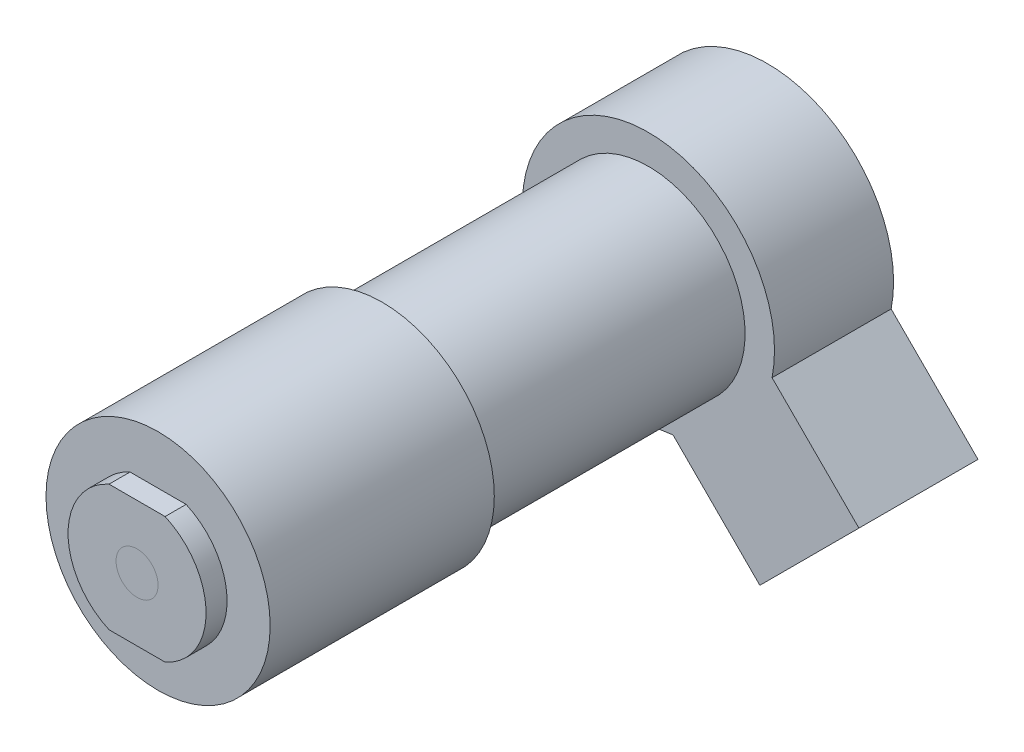
ISO-10303-21;
HEADER;
FILE_DESCRIPTION(('STEP AP214'),'2;1');
FILE_NAME('part.step','',(''),(''),'','','');
FILE_SCHEMA(('AUTOMOTIVE_DESIGN { 1 0 10303 214 1 1 1 1 }'));
ENDSEC;
DATA;
#1=APPLICATION_CONTEXT('core data for automotive mechanical design processes');
#2=APPLICATION_PROTOCOL_DEFINITION('international standard','automotive_design',2000,#1);
#3=PRODUCT_CONTEXT('',#1,'mechanical');
#4=PRODUCT('Part','Part','',(#3));
#5=PRODUCT_RELATED_PRODUCT_CATEGORY('part','',(#4));
#6=PRODUCT_DEFINITION_FORMATION('','',#4);
#7=PRODUCT_DEFINITION_CONTEXT('part definition',#1,'design');
#8=PRODUCT_DEFINITION('design','',#6,#7);
#9=PRODUCT_DEFINITION_SHAPE('','',#8);
#10=(LENGTH_UNIT() NAMED_UNIT(*) SI_UNIT(.MILLI.,.METRE.));
#11=(NAMED_UNIT(*) PLANE_ANGLE_UNIT() SI_UNIT($,.RADIAN.));
#12=(NAMED_UNIT(*) SI_UNIT($,.STERADIAN.) SOLID_ANGLE_UNIT());
#13=UNCERTAINTY_MEASURE_WITH_UNIT(LENGTH_MEASURE(1.E-05),#10,'distance_accuracy_value','');
#14=(GEOMETRIC_REPRESENTATION_CONTEXT(3) GLOBAL_UNCERTAINTY_ASSIGNED_CONTEXT((#13)) GLOBAL_UNIT_ASSIGNED_CONTEXT((#10,
#11,#12)) REPRESENTATION_CONTEXT('',''));
#15=CARTESIAN_POINT('',(0.,0.,0.));
#16=DIRECTION('',(0.,0.,1.));
#17=DIRECTION('',(1.,0.,0.));
#18=AXIS2_PLACEMENT_3D('',#15,#16,#17);
#19=CARTESIAN_POINT('',(0.,0.,3.));
#20=DIRECTION('',(0.,0.,1.));
#21=DIRECTION('',(1.,0.,0.));
#22=AXIS2_PLACEMENT_3D('',#19,#20,#21);
#23=PLANE('',#22);
#24=CARTESIAN_POINT('',(0.,0.,3.));
#25=DIRECTION('',(0.,0.,1.));
#26=DIRECTION('',(1.,0.,0.));
#27=AXIS2_PLACEMENT_3D('',#24,#25,#26);
#28=CIRCLE('',#27,9.85);
#29=CARTESIAN_POINT('',(-4.00281151192509,9.,3.));
#30=VERTEX_POINT('',#29);
#31=CARTESIAN_POINT('',(-4.00281151192509,-9.,3.));
#32=VERTEX_POINT('',#31);
#33=EDGE_CURVE('E159',#30,#32,#28,.T.);
#34=ORIENTED_EDGE('',*,*,#33,.T.);
#35=DIRECTION('',(1.,0.,0.));
#36=VECTOR('',#35,1.);
#37=CARTESIAN_POINT('',(-4.00281151192509,-9.,3.));
#38=LINE('',#37,#36);
#39=CARTESIAN_POINT('',(4.00281151192509,-9.,3.));
#40=VERTEX_POINT('',#39);
#41=EDGE_CURVE('E161',#32,#40,#38,.T.);
#42=ORIENTED_EDGE('',*,*,#41,.T.);
#43=CARTESIAN_POINT('',(0.,0.,3.));
#44=DIRECTION('',(0.,0.,1.));
#45=DIRECTION('',(1.,0.,0.));
#46=AXIS2_PLACEMENT_3D('',#43,#44,#45);
#47=CIRCLE('',#46,9.85);
#48=CARTESIAN_POINT('',(4.00281151192509,9.,3.));
#49=VERTEX_POINT('',#48);
#50=EDGE_CURVE('E164',#40,#49,#47,.T.);
#51=ORIENTED_EDGE('',*,*,#50,.T.);
#52=DIRECTION('',(-1.,0.,0.));
#53=VECTOR('',#52,1.);
#54=CARTESIAN_POINT('',(-4.00281151192509,9.,3.));
#55=LINE('',#54,#53);
#56=EDGE_CURVE('E60',#49,#30,#55,.T.);
#57=ORIENTED_EDGE('',*,*,#56,.T.);
#58=EDGE_LOOP('',(#34,#42,#51,#57));
#59=FACE_BOUND('',#58,.T.);
#60=CARTESIAN_POINT('',(0.,0.,3.));
#61=DIRECTION('',(0.,0.,1.));
#62=DIRECTION('',(1.,0.,0.));
#63=AXIS2_PLACEMENT_3D('',#60,#61,#62);
#64=CIRCLE('',#63,3.);
#65=CARTESIAN_POINT('',(3.,0.,3.));
#66=VERTEX_POINT('',#65);
#67=EDGE_CURVE('E11',#66,#66,#64,.F.);
#68=ORIENTED_EDGE('',*,*,#67,.T.);
#69=EDGE_LOOP('',(#68));
#70=FACE_BOUND('',#69,.T.);
#71=ADVANCED_FACE('F43',(#59,#70),#23,.T.);
#72=CARTESIAN_POINT('',(0.,0.,3.));
#73=DIRECTION('',(0.,0.,-1.));
#74=DIRECTION('',(-1.,0.,0.));
#75=AXIS2_PLACEMENT_3D('',#72,#73,#74);
#76=CYLINDRICAL_SURFACE('',#75,9.85);
#77=CARTESIAN_POINT('',(0.,0.,0.));
#78=DIRECTION('',(0.,0.,1.));
#79=DIRECTION('',(1.,0.,0.));
#80=AXIS2_PLACEMENT_3D('',#77,#78,#79);
#81=CIRCLE('',#80,9.85);
#82=CARTESIAN_POINT('',(-4.00281151192509,9.,0.));
#83=VERTEX_POINT('',#82);
#84=CARTESIAN_POINT('',(-4.00281151192509,-9.,0.));
#85=VERTEX_POINT('',#84);
#86=EDGE_CURVE('E156',#83,#85,#81,.T.);
#87=ORIENTED_EDGE('',*,*,#86,.T.);
#88=DIRECTION('',(0.,0.,-1.));
#89=VECTOR('',#88,1.);
#90=CARTESIAN_POINT('',(-4.00281151192509,-9.,3.));
#91=LINE('',#90,#89);
#92=EDGE_CURVE('E152',#32,#85,#91,.T.);
#93=ORIENTED_EDGE('',*,*,#92,.F.);
#94=ORIENTED_EDGE('',*,*,#33,.F.);
#95=DIRECTION('',(0.,0.,-1.));
#96=VECTOR('',#95,1.);
#97=CARTESIAN_POINT('',(-4.00281151192509,9.,3.));
#98=LINE('',#97,#96);
#99=EDGE_CURVE('E167',#30,#83,#98,.T.);
#100=ORIENTED_EDGE('',*,*,#99,.T.);
#101=EDGE_LOOP('',(#87,#93,#94,#100));
#102=FACE_BOUND('',#101,.T.);
#103=ADVANCED_FACE('F45',(#102),#76,.T.);
#104=CARTESIAN_POINT('',(-4.00281151192509,-9.,3.));
#105=DIRECTION('',(0.,1.,0.));
#106=DIRECTION('',(-1.,0.,0.));
#107=AXIS2_PLACEMENT_3D('',#104,#105,#106);
#108=PLANE('',#107);
#109=DIRECTION('',(1.,0.,0.));
#110=VECTOR('',#109,1.);
#111=CARTESIAN_POINT('',(-4.00281151192509,-9.,0.));
#112=LINE('',#111,#110);
#113=CARTESIAN_POINT('',(4.00281151192509,-9.,0.));
#114=VERTEX_POINT('',#113);
#115=EDGE_CURVE('E170',#85,#114,#112,.T.);
#116=ORIENTED_EDGE('',*,*,#115,.T.);
#117=DIRECTION('',(0.,0.,-1.));
#118=VECTOR('',#117,1.);
#119=CARTESIAN_POINT('',(4.00281151192509,-9.,3.));
#120=LINE('',#119,#118);
#121=EDGE_CURVE('E183',#40,#114,#120,.T.);
#122=ORIENTED_EDGE('',*,*,#121,.F.);
#123=ORIENTED_EDGE('',*,*,#41,.F.);
#124=ORIENTED_EDGE('',*,*,#92,.T.);
#125=EDGE_LOOP('',(#116,#122,#123,#124));
#126=FACE_BOUND('',#125,.T.);
#127=ADVANCED_FACE('F188',(#126),#108,.F.);
#128=CARTESIAN_POINT('',(0.,0.,3.));
#129=DIRECTION('',(0.,0.,-1.));
#130=DIRECTION('',(-1.,0.,0.));
#131=AXIS2_PLACEMENT_3D('',#128,#129,#130);
#132=CYLINDRICAL_SURFACE('',#131,9.85);
#133=CARTESIAN_POINT('',(0.,0.,0.));
#134=DIRECTION('',(0.,0.,1.));
#135=DIRECTION('',(1.,0.,0.));
#136=AXIS2_PLACEMENT_3D('',#133,#134,#135);
#137=CIRCLE('',#136,9.85);
#138=CARTESIAN_POINT('',(4.00281151192509,9.,0.));
#139=VERTEX_POINT('',#138);
#140=EDGE_CURVE('E173',#114,#139,#137,.T.);
#141=ORIENTED_EDGE('',*,*,#140,.T.);
#142=DIRECTION('',(0.,0.,-1.));
#143=VECTOR('',#142,1.);
#144=CARTESIAN_POINT('',(4.00281151192509,9.,3.));
#145=LINE('',#144,#143);
#146=EDGE_CURVE('E180',#49,#139,#145,.T.);
#147=ORIENTED_EDGE('',*,*,#146,.F.);
#148=ORIENTED_EDGE('',*,*,#50,.F.);
#149=ORIENTED_EDGE('',*,*,#121,.T.);
#150=EDGE_LOOP('',(#141,#147,#148,#149));
#151=FACE_BOUND('',#150,.T.);
#152=ADVANCED_FACE('F201',(#151),#132,.T.);
#153=CARTESIAN_POINT('',(-4.00281151192509,9.,3.));
#154=DIRECTION('',(0.,-1.,0.));
#155=DIRECTION('',(1.,0.,0.));
#156=AXIS2_PLACEMENT_3D('',#153,#154,#155);
#157=PLANE('',#156);
#158=DIRECTION('',(-1.,0.,0.));
#159=VECTOR('',#158,1.);
#160=CARTESIAN_POINT('',(-4.00281151192509,9.,0.));
#161=LINE('',#160,#159);
#162=EDGE_CURVE('E162',#139,#83,#161,.T.);
#163=ORIENTED_EDGE('',*,*,#162,.T.);
#164=ORIENTED_EDGE('',*,*,#99,.F.);
#165=ORIENTED_EDGE('',*,*,#56,.F.);
#166=ORIENTED_EDGE('',*,*,#146,.T.);
#167=EDGE_LOOP('',(#163,#164,#165,#166));
#168=FACE_BOUND('',#167,.T.);
#169=ADVANCED_FACE('F197',(#168),#157,.F.);
#170=ORIENTED_EDGE('',*,*,#67,.F.);
#171=EDGE_LOOP('',(#170));
#172=FACE_BOUND('',#171,.T.);
#173=ADVANCED_FACE('F205',(#172),#23,.T.);
#174=CARTESIAN_POINT('',(0.,0.,-32.));
#175=DIRECTION('',(0.,0.,1.));
#176=DIRECTION('',(1.,0.,0.));
#177=AXIS2_PLACEMENT_3D('',#174,#175,#176);
#178=CYLINDRICAL_SURFACE('',#177,16.);
#179=CARTESIAN_POINT('',(0.,0.,-32.));
#180=DIRECTION('',(0.,0.,-1.));
#181=DIRECTION('',(-1.,0.,0.));
#182=AXIS2_PLACEMENT_3D('',#179,#180,#181);
#183=CIRCLE('',#182,16.);
#184=CARTESIAN_POINT('',(-16.,0.,-32.));
#185=VERTEX_POINT('',#184);
#186=EDGE_CURVE('E153',#185,#185,#183,.T.);
#187=ORIENTED_EDGE('',*,*,#186,.F.);
#188=EDGE_LOOP('',(#187));
#189=FACE_BOUND('',#188,.T.);
#190=CARTESIAN_POINT('',(0.,0.,0.));
#191=DIRECTION('',(0.,0.,-1.));
#192=DIRECTION('',(-1.,0.,0.));
#193=AXIS2_PLACEMENT_3D('',#190,#191,#192);
#194=CIRCLE('',#193,16.);
#195=CARTESIAN_POINT('',(-16.,0.,0.));
#196=VERTEX_POINT('',#195);
#197=EDGE_CURVE('E149',#196,#196,#194,.T.);
#198=ORIENTED_EDGE('',*,*,#197,.T.);
#199=EDGE_LOOP('',(#198));
#200=FACE_BOUND('',#199,.T.);
#201=ADVANCED_FACE('F209',(#189,#200),#178,.T.);
#202=CARTESIAN_POINT('',(0.,0.,-32.));
#203=DIRECTION('',(0.,0.,-1.));
#204=DIRECTION('',(-1.,0.,0.));
#205=AXIS2_PLACEMENT_3D('',#202,#203,#204);
#206=PLANE('',#205);
#207=CARTESIAN_POINT('',(0.,0.,-32.));
#208=DIRECTION('',(0.,0.,-1.));
#209=DIRECTION('',(-1.,0.,0.));
#210=AXIS2_PLACEMENT_3D('',#207,#208,#209);
#211=CIRCLE('',#210,13.8);
#212=CARTESIAN_POINT('',(-13.8,0.,-32.));
#213=VERTEX_POINT('',#212);
#214=EDGE_CURVE('E53',#213,#213,#211,.T.);
#215=ORIENTED_EDGE('',*,*,#214,.F.);
#216=EDGE_LOOP('',(#215));
#217=FACE_BOUND('',#216,.T.);
#218=ORIENTED_EDGE('',*,*,#186,.T.);
#219=EDGE_LOOP('',(#218));
#220=FACE_BOUND('',#219,.T.);
#221=ADVANCED_FACE('F214',(#217,#220),#206,.T.);
#222=CARTESIAN_POINT('',(0.,0.,0.));
#223=DIRECTION('',(0.,0.,-1.));
#224=DIRECTION('',(-1.,0.,0.));
#225=AXIS2_PLACEMENT_3D('',#222,#223,#224);
#226=PLANE('',#225);
#227=ORIENTED_EDGE('',*,*,#86,.F.);
#228=ORIENTED_EDGE('',*,*,#162,.F.);
#229=ORIENTED_EDGE('',*,*,#140,.F.);
#230=ORIENTED_EDGE('',*,*,#115,.F.);
#231=EDGE_LOOP('',(#227,#228,#229,#230));
#232=FACE_BOUND('',#231,.T.);
#233=ORIENTED_EDGE('',*,*,#197,.F.);
#234=EDGE_LOOP('',(#233));
#235=FACE_BOUND('',#234,.T.);
#236=ADVANCED_FACE('F193',(#232,#235),#226,.F.);
#237=CARTESIAN_POINT('',(0.,0.,-70.));
#238=DIRECTION('',(0.,0.,1.));
#239=DIRECTION('',(1.,0.,0.));
#240=AXIS2_PLACEMENT_3D('',#237,#238,#239);
#241=CYLINDRICAL_SURFACE('',#240,13.8);
#242=CARTESIAN_POINT('',(0.,0.,-70.));
#243=DIRECTION('',(0.,0.,-1.));
#244=DIRECTION('',(-1.,0.,0.));
#245=AXIS2_PLACEMENT_3D('',#242,#243,#244);
#246=CIRCLE('',#245,13.8);
#247=CARTESIAN_POINT('',(-13.8,0.,-70.));
#248=VERTEX_POINT('',#247);
#249=EDGE_CURVE('E125',#248,#248,#246,.T.);
#250=ORIENTED_EDGE('',*,*,#249,.F.);
#251=EDGE_LOOP('',(#250));
#252=FACE_BOUND('',#251,.T.);
#253=ORIENTED_EDGE('',*,*,#214,.T.);
#254=EDGE_LOOP('',(#253));
#255=FACE_BOUND('',#254,.T.);
#256=ADVANCED_FACE('F295',(#252,#255),#241,.T.);
#257=CARTESIAN_POINT('',(0.,0.,-87.));
#258=DIRECTION('',(0.,0.,1.));
#259=DIRECTION('',(1.,0.,0.));
#260=AXIS2_PLACEMENT_3D('',#257,#258,#259);
#261=CYLINDRICAL_SURFACE('',#260,18.);
#262=CARTESIAN_POINT('',(0.,0.,-70.));
#263=DIRECTION('',(0.,0.,-1.));
#264=DIRECTION('',(-1.,0.,0.));
#265=AXIS2_PLACEMENT_3D('',#262,#263,#264);
#266=CIRCLE('',#265,18.);
#267=CARTESIAN_POINT('',(3.51193743239294,-17.6540730561238,-70.));
#268=VERTEX_POINT('',#267);
#269=CARTESIAN_POINT('',(17.6540730561238,-3.51193743239285,-70.));
#270=VERTEX_POINT('',#269);
#271=EDGE_CURVE('E121',#268,#270,#266,.T.);
#272=ORIENTED_EDGE('',*,*,#271,.T.);
#273=DIRECTION('',(0.,0.,1.));
#274=VECTOR('',#273,1.);
#275=CARTESIAN_POINT('',(17.6540730561238,-3.51193743239285,-87.));
#276=LINE('',#275,#274);
#277=CARTESIAN_POINT('',(17.6540730561238,-3.51193743239285,-87.));
#278=VERTEX_POINT('',#277);
#279=EDGE_CURVE('E118',#278,#270,#276,.T.);
#280=ORIENTED_EDGE('',*,*,#279,.F.);
#281=CARTESIAN_POINT('',(0.,0.,-87.));
#282=DIRECTION('',(0.,0.,-1.));
#283=DIRECTION('',(-1.,0.,0.));
#284=AXIS2_PLACEMENT_3D('',#281,#282,#283);
#285=CIRCLE('',#284,18.);
#286=CARTESIAN_POINT('',(3.51193743239294,-17.6540730561238,-87.));
#287=VERTEX_POINT('',#286);
#288=EDGE_CURVE('E105',#287,#278,#285,.T.);
#289=ORIENTED_EDGE('',*,*,#288,.F.);
#290=DIRECTION('',(0.,0.,1.));
#291=VECTOR('',#290,1.);
#292=CARTESIAN_POINT('',(3.51193743239294,-17.6540730561238,-87.));
#293=LINE('',#292,#291);
#294=EDGE_CURVE('E135',#287,#268,#293,.T.);
#295=ORIENTED_EDGE('',*,*,#294,.T.);
#296=EDGE_LOOP('',(#272,#280,#289,#295));
#297=FACE_BOUND('',#296,.T.);
#298=ADVANCED_FACE('F119',(#297),#261,.T.);
#299=CARTESIAN_POINT('',(7.07106781186548,7.07106781186549,-87.));
#300=DIRECTION('',(0.707106781186547,0.707106781186548,0.));
#301=DIRECTION('',(-0.707106781186548,0.707106781186547,0.));
#302=AXIS2_PLACEMENT_3D('',#299,#300,#301);
#303=PLANE('',#302);
#304=DIRECTION('',(-0.707106781186548,0.707106781186547,0.));
#305=VECTOR('',#304,1.);
#306=CARTESIAN_POINT('',(7.07106781186548,7.07106781186549,-70.));
#307=LINE('',#306,#305);
#308=CARTESIAN_POINT('',(30.0520382004283,-15.9099025766973,-70.));
#309=VERTEX_POINT('',#308);
#310=EDGE_CURVE('E137',#309,#270,#307,.T.);
#311=ORIENTED_EDGE('',*,*,#310,.F.);
#312=DIRECTION('',(0.,0.,1.));
#313=VECTOR('',#312,1.);
#314=CARTESIAN_POINT('',(30.0520382004283,-15.9099025766973,-87.));
#315=LINE('',#314,#313);
#316=CARTESIAN_POINT('',(30.0520382004283,-15.9099025766973,-87.));
#317=VERTEX_POINT('',#316);
#318=EDGE_CURVE('E126',#317,#309,#315,.T.);
#319=ORIENTED_EDGE('',*,*,#318,.F.);
#320=DIRECTION('',(-0.707106781186548,0.707106781186547,0.));
#321=VECTOR('',#320,1.);
#322=CARTESIAN_POINT('',(7.07106781186548,7.07106781186549,-87.));
#323=LINE('',#322,#321);
#324=EDGE_CURVE('E109',#317,#278,#323,.T.);
#325=ORIENTED_EDGE('',*,*,#324,.T.);
#326=ORIENTED_EDGE('',*,*,#279,.T.);
#327=EDGE_LOOP('',(#311,#319,#325,#326));
#328=FACE_BOUND('',#327,.T.);
#329=ADVANCED_FACE('F128',(#328),#303,.T.);
#330=CARTESIAN_POINT('',(22.9809703885628,-22.9809703885628,-87.));
#331=DIRECTION('',(-0.707106781186548,0.707106781186547,0.));
#332=DIRECTION('',(-0.707106781186547,-0.707106781186548,0.));
#333=AXIS2_PLACEMENT_3D('',#330,#331,#332);
#334=PLANE('',#333);
#335=DIRECTION('',(-0.707106781186547,-0.707106781186548,0.));
#336=VECTOR('',#335,1.);
#337=CARTESIAN_POINT('',(22.9809703885628,-22.9809703885628,-70.));
#338=LINE('',#337,#336);
#339=CARTESIAN_POINT('',(15.9099025766974,-30.0520382004282,-70.));
#340=VERTEX_POINT('',#339);
#341=EDGE_CURVE('E139',#309,#340,#338,.T.);
#342=ORIENTED_EDGE('',*,*,#341,.T.);
#343=DIRECTION('',(0.,0.,1.));
#344=VECTOR('',#343,1.);
#345=CARTESIAN_POINT('',(15.9099025766974,-30.0520382004282,-87.));
#346=LINE('',#345,#344);
#347=CARTESIAN_POINT('',(15.9099025766974,-30.0520382004282,-87.));
#348=VERTEX_POINT('',#347);
#349=EDGE_CURVE('E143',#348,#340,#346,.T.);
#350=ORIENTED_EDGE('',*,*,#349,.F.);
#351=DIRECTION('',(-0.707106781186547,-0.707106781186548,0.));
#352=VECTOR('',#351,1.);
#353=CARTESIAN_POINT('',(22.9809703885628,-22.9809703885628,-87.));
#354=LINE('',#353,#352);
#355=EDGE_CURVE('E130',#317,#348,#354,.T.);
#356=ORIENTED_EDGE('',*,*,#355,.F.);
#357=ORIENTED_EDGE('',*,*,#318,.T.);
#358=EDGE_LOOP('',(#342,#350,#356,#357));
#359=FACE_BOUND('',#358,.T.);
#360=ADVANCED_FACE('F268',(#359),#334,.F.);
#361=CARTESIAN_POINT('',(-7.07106781186544,-7.07106781186544,-87.));
#362=DIRECTION('',(0.707106781186547,0.707106781186547,0.));
#363=DIRECTION('',(-0.707106781186548,0.707106781186548,0.));
#364=AXIS2_PLACEMENT_3D('',#361,#362,#363);
#365=PLANE('',#364);
#366=DIRECTION('',(-0.707106781186548,0.707106781186548,0.));
#367=VECTOR('',#366,1.);
#368=CARTESIAN_POINT('',(-7.07106781186544,-7.07106781186544,-70.));
#369=LINE('',#368,#367);
#370=EDGE_CURVE('E115',#340,#268,#369,.T.);
#371=ORIENTED_EDGE('',*,*,#370,.T.);
#372=ORIENTED_EDGE('',*,*,#294,.F.);
#373=DIRECTION('',(-0.707106781186548,0.707106781186548,0.));
#374=VECTOR('',#373,1.);
#375=CARTESIAN_POINT('',(-7.07106781186544,-7.07106781186544,-87.));
#376=LINE('',#375,#374);
#377=EDGE_CURVE('E111',#348,#287,#376,.T.);
#378=ORIENTED_EDGE('',*,*,#377,.F.);
#379=ORIENTED_EDGE('',*,*,#349,.T.);
#380=EDGE_LOOP('',(#371,#372,#378,#379));
#381=FACE_BOUND('',#380,.T.);
#382=ADVANCED_FACE('F258',(#381),#365,.F.);
#383=CARTESIAN_POINT('',(0.,0.,-87.));
#384=DIRECTION('',(0.,0.,-1.));
#385=DIRECTION('',(-1.,0.,0.));
#386=AXIS2_PLACEMENT_3D('',#383,#384,#385);
#387=PLANE('',#386);
#388=ORIENTED_EDGE('',*,*,#288,.T.);
#389=ORIENTED_EDGE('',*,*,#324,.F.);
#390=ORIENTED_EDGE('',*,*,#355,.T.);
#391=ORIENTED_EDGE('',*,*,#377,.T.);
#392=EDGE_LOOP('',(#388,#389,#390,#391));
#393=FACE_BOUND('',#392,.T.);
#394=ADVANCED_FACE('F107',(#393),#387,.T.);
#395=CARTESIAN_POINT('',(0.,0.,-70.));
#396=DIRECTION('',(0.,0.,-1.));
#397=DIRECTION('',(-1.,0.,0.));
#398=AXIS2_PLACEMENT_3D('',#395,#396,#397);
#399=PLANE('',#398);
#400=ORIENTED_EDGE('',*,*,#249,.T.);
#401=EDGE_LOOP('',(#400));
#402=FACE_BOUND('',#401,.T.);
#403=ORIENTED_EDGE('',*,*,#271,.F.);
#404=ORIENTED_EDGE('',*,*,#370,.F.);
#405=ORIENTED_EDGE('',*,*,#341,.F.);
#406=ORIENTED_EDGE('',*,*,#310,.T.);
#407=EDGE_LOOP('',(#403,#404,#405,#406));
#408=FACE_BOUND('',#407,.T.);
#409=ADVANCED_FACE('F238',(#402,#408),#399,.F.);
#410=CLOSED_SHELL('',(#71,#103,#127,#152,#169,#173,#201,#221,#236,#256,#298,#329,#360,#382,#394,#409));
#411=MANIFOLD_SOLID_BREP('B2',#410);
#412=ADVANCED_BREP_SHAPE_REPRESENTATION('',(#18,#411),#14);
#413=SHAPE_DEFINITION_REPRESENTATION(#9,#412);
ENDSEC;
END-ISO-10303-21;
